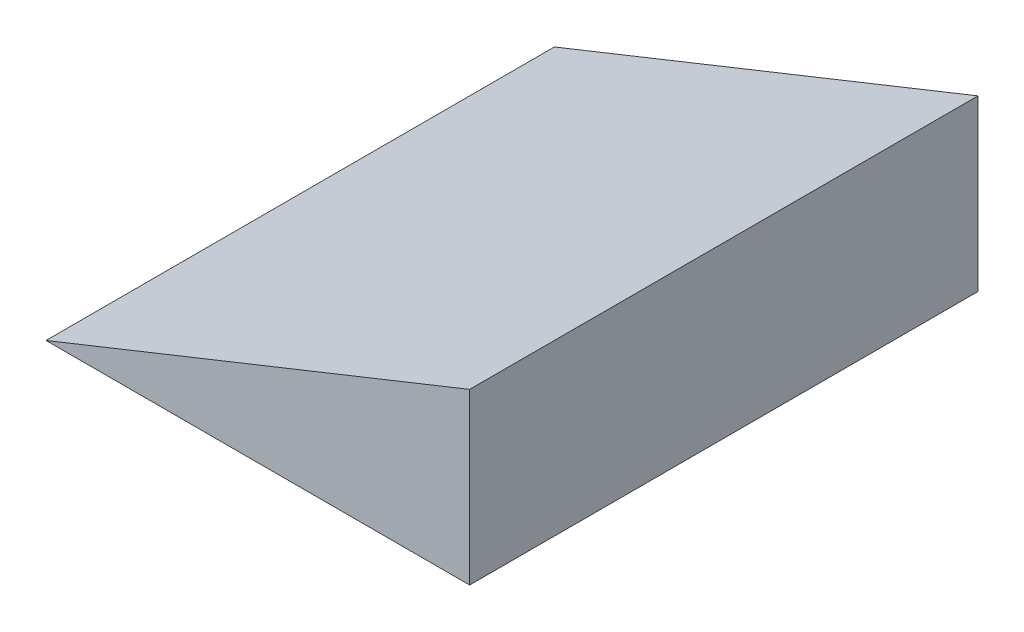
ISO-10303-21;
HEADER;
FILE_DESCRIPTION(('STEP AP214'),'2;1');
FILE_NAME('part.step','',(''),(''),'','','');
FILE_SCHEMA(('AUTOMOTIVE_DESIGN { 1 0 10303 214 1 1 1 1 }'));
ENDSEC;
DATA;
#1=APPLICATION_CONTEXT('core data for automotive mechanical design processes');
#2=APPLICATION_PROTOCOL_DEFINITION('international standard','automotive_design',2000,#1);
#3=PRODUCT_CONTEXT('',#1,'mechanical');
#4=PRODUCT('Part','Part','',(#3));
#5=PRODUCT_RELATED_PRODUCT_CATEGORY('part','',(#4));
#6=PRODUCT_DEFINITION_FORMATION('','',#4);
#7=PRODUCT_DEFINITION_CONTEXT('part definition',#1,'design');
#8=PRODUCT_DEFINITION('design','',#6,#7);
#9=PRODUCT_DEFINITION_SHAPE('','',#8);
#10=(LENGTH_UNIT() NAMED_UNIT(*) SI_UNIT(.MILLI.,.METRE.));
#11=(NAMED_UNIT(*) PLANE_ANGLE_UNIT() SI_UNIT($,.RADIAN.));
#12=(NAMED_UNIT(*) SI_UNIT($,.STERADIAN.) SOLID_ANGLE_UNIT());
#13=UNCERTAINTY_MEASURE_WITH_UNIT(LENGTH_MEASURE(1.E-05),#10,'distance_accuracy_value','');
#14=(GEOMETRIC_REPRESENTATION_CONTEXT(3) GLOBAL_UNCERTAINTY_ASSIGNED_CONTEXT((#13)) GLOBAL_UNIT_ASSIGNED_CONTEXT((#10,
#11,#12)) REPRESENTATION_CONTEXT('',''));
#15=CARTESIAN_POINT('',(0.,0.,0.));
#16=DIRECTION('',(0.,0.,1.));
#17=DIRECTION('',(1.,0.,0.));
#18=AXIS2_PLACEMENT_3D('',#15,#16,#17);
#19=CARTESIAN_POINT('',(-103.019227926069,100.,174.550304640674));
#20=DIRECTION('',(0.,0.,-1.));
#21=DIRECTION('',(-1.,0.,0.));
#22=AXIS2_PLACEMENT_3D('',#19,#20,#21);
#23=PLANE('',#22);
#24=DIRECTION('',(0.,-1.,0.));
#25=VECTOR('',#24,1.);
#26=CARTESIAN_POINT('',(146.980772073932,100.,174.550304640674));
#27=LINE('',#26,#25);
#28=CARTESIAN_POINT('',(146.980772073932,100.,174.550304640674));
#29=VERTEX_POINT('',#28);
#30=CARTESIAN_POINT('',(146.980772073932,0.,174.550304640674));
#31=VERTEX_POINT('',#30);
#32=EDGE_CURVE('E11',#29,#31,#27,.T.);
#33=ORIENTED_EDGE('',*,*,#32,.F.);
#34=DIRECTION('',(0.928476690885259,0.371390676354104,0.));
#35=VECTOR('',#34,1.);
#36=CARTESIAN_POINT('',(-103.019227926069,0.,174.550304640674));
#37=LINE('',#36,#35);
#38=CARTESIAN_POINT('',(-103.019227926069,0.,174.550304640674));
#39=VERTEX_POINT('',#38);
#40=EDGE_CURVE('E76',#39,#29,#37,.T.);
#41=ORIENTED_EDGE('',*,*,#40,.F.);
#42=DIRECTION('',(1.,0.,0.));
#43=VECTOR('',#42,1.);
#44=CARTESIAN_POINT('',(-103.019227926069,0.,174.550304640674));
#45=LINE('',#44,#43);
#46=EDGE_CURVE('E82',#39,#31,#45,.T.);
#47=ORIENTED_EDGE('',*,*,#46,.T.);
#48=EDGE_LOOP('',(#33,#41,#47));
#49=FACE_BOUND('',#48,.T.);
#50=ADVANCED_FACE('F39',(#49),#23,.F.);
#51=CARTESIAN_POINT('',(146.980772073932,100.,-125.449695359326));
#52=DIRECTION('',(-1.,0.,0.));
#53=DIRECTION('',(0.,0.,1.));
#54=AXIS2_PLACEMENT_3D('',#51,#52,#53);
#55=PLANE('',#54);
#56=DIRECTION('',(0.,0.,-1.));
#57=VECTOR('',#56,1.);
#58=CARTESIAN_POINT('',(146.980772073932,0.,-125.449695359326));
#59=LINE('',#58,#57);
#60=CARTESIAN_POINT('',(146.980772073932,0.,-125.449695359326));
#61=VERTEX_POINT('',#60);
#62=EDGE_CURVE('E61',#31,#61,#59,.T.);
#63=ORIENTED_EDGE('',*,*,#62,.T.);
#64=DIRECTION('',(0.,-1.,0.));
#65=VECTOR('',#64,1.);
#66=CARTESIAN_POINT('',(146.980772073932,100.,-125.449695359326));
#67=LINE('',#66,#65);
#68=CARTESIAN_POINT('',(146.980772073932,100.,-125.449695359326));
#69=VERTEX_POINT('',#68);
#70=EDGE_CURVE('E47',#69,#61,#67,.T.);
#71=ORIENTED_EDGE('',*,*,#70,.F.);
#72=DIRECTION('',(0.,0.,-1.));
#73=VECTOR('',#72,1.);
#74=CARTESIAN_POINT('',(146.980772073932,100.,-125.449695359326));
#75=LINE('',#74,#73);
#76=EDGE_CURVE('E97',#29,#69,#75,.T.);
#77=ORIENTED_EDGE('',*,*,#76,.F.);
#78=ORIENTED_EDGE('',*,*,#32,.T.);
#79=EDGE_LOOP('',(#63,#71,#77,#78));
#80=FACE_BOUND('',#79,.T.);
#81=ADVANCED_FACE('F104',(#80),#55,.F.);
#82=CARTESIAN_POINT('',(-103.019227926069,100.,-125.449695359326));
#83=DIRECTION('',(0.,0.,1.));
#84=DIRECTION('',(1.,0.,0.));
#85=AXIS2_PLACEMENT_3D('',#82,#83,#84);
#86=PLANE('',#85);
#87=DIRECTION('',(-1.,0.,0.));
#88=VECTOR('',#87,1.);
#89=CARTESIAN_POINT('',(-103.019227926069,0.,-125.449695359326));
#90=LINE('',#89,#88);
#91=CARTESIAN_POINT('',(-103.019227926069,0.,-125.449695359326));
#92=VERTEX_POINT('',#91);
#93=EDGE_CURVE('E92',#61,#92,#90,.T.);
#94=ORIENTED_EDGE('',*,*,#93,.T.);
#95=DIRECTION('',(-0.92847669088526,-0.371390676354104,0.));
#96=VECTOR('',#95,1.);
#97=CARTESIAN_POINT('',(-103.019227926069,0.,-125.449695359326));
#98=LINE('',#97,#96);
#99=EDGE_CURVE('E54',#69,#92,#98,.T.);
#100=ORIENTED_EDGE('',*,*,#99,.F.);
#101=ORIENTED_EDGE('',*,*,#70,.T.);
#102=EDGE_LOOP('',(#94,#100,#101));
#103=FACE_BOUND('',#102,.T.);
#104=ADVANCED_FACE('F103',(#103),#86,.F.);
#105=CARTESIAN_POINT('',(0.,0.,0.));
#106=DIRECTION('',(0.,1.,0.));
#107=DIRECTION('',(0.,0.,1.));
#108=AXIS2_PLACEMENT_3D('',#105,#106,#107);
#109=PLANE('',#108);
#110=DIRECTION('',(0.,0.,1.));
#111=VECTOR('',#110,1.);
#112=CARTESIAN_POINT('',(-103.019227926069,0.,-125.449695359326));
#113=LINE('',#112,#111);
#114=EDGE_CURVE('E73',#92,#39,#113,.T.);
#115=ORIENTED_EDGE('',*,*,#114,.F.);
#116=ORIENTED_EDGE('',*,*,#93,.F.);
#117=ORIENTED_EDGE('',*,*,#62,.F.);
#118=ORIENTED_EDGE('',*,*,#46,.F.);
#119=EDGE_LOOP('',(#115,#116,#117,#118));
#120=FACE_BOUND('',#119,.T.);
#121=ADVANCED_FACE('F88',(#120),#109,.F.);
#122=CARTESIAN_POINT('',(-103.019227926069,0.,-125.450695359326));
#123=DIRECTION('',(0.371390676354104,-0.928476690885259,0.));
#124=DIRECTION('',(0.92847669088526,0.371390676354104,0.));
#125=AXIS2_PLACEMENT_3D('',#122,#123,#124);
#126=PLANE('',#125);
#127=ORIENTED_EDGE('',*,*,#99,.T.);
#128=ORIENTED_EDGE('',*,*,#114,.T.);
#129=ORIENTED_EDGE('',*,*,#40,.T.);
#130=ORIENTED_EDGE('',*,*,#76,.T.);
#131=EDGE_LOOP('',(#127,#128,#129,#130));
#132=FACE_BOUND('',#131,.T.);
#133=ADVANCED_FACE('F75',(#132),#126,.F.);
#134=CLOSED_SHELL('',(#50,#81,#104,#121,#133));
#135=MANIFOLD_SOLID_BREP('B2',#134);
#136=ADVANCED_BREP_SHAPE_REPRESENTATION('',(#18,#135),#14);
#137=SHAPE_DEFINITION_REPRESENTATION(#9,#136);
ENDSEC;
END-ISO-10303-21;
